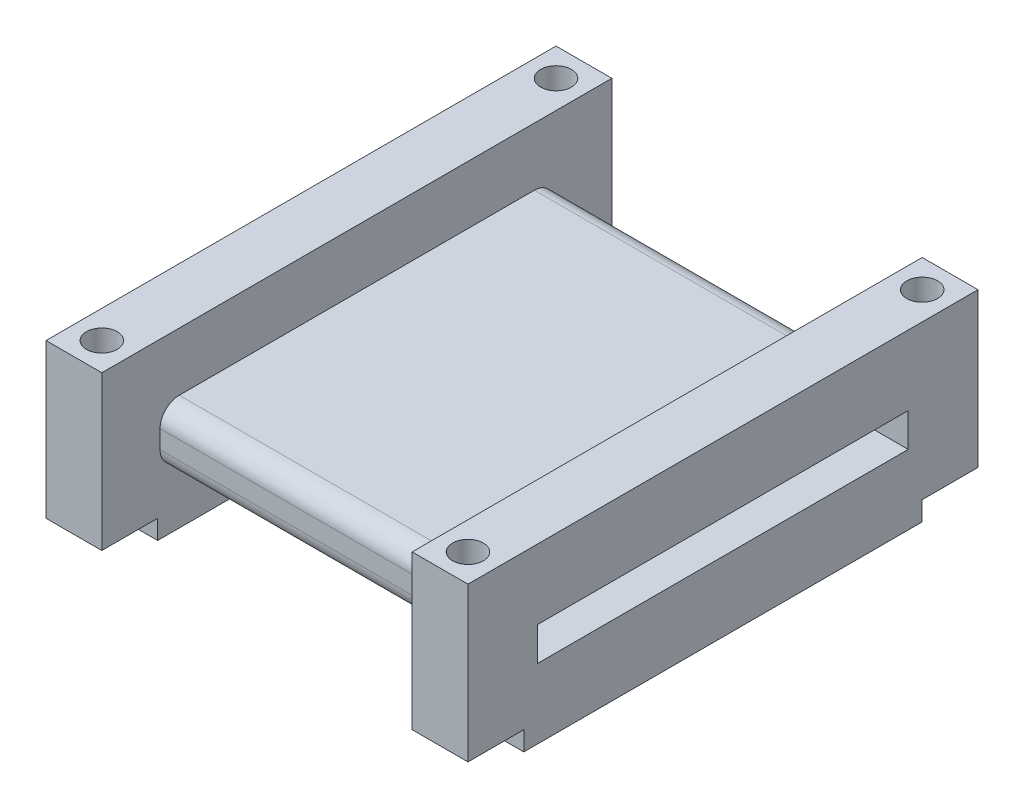
ISO-10303-21;
HEADER;
FILE_DESCRIPTION(('STEP AP214'),'2;1');
FILE_NAME('part.step','',(''),(''),'','','');
FILE_SCHEMA(('AUTOMOTIVE_DESIGN { 1 0 10303 214 1 1 1 1 }'));
ENDSEC;
DATA;
#1=APPLICATION_CONTEXT('core data for automotive mechanical design processes');
#2=APPLICATION_PROTOCOL_DEFINITION('international standard','automotive_design',2000,#1);
#3=PRODUCT_CONTEXT('',#1,'mechanical');
#4=PRODUCT('Part','Part','',(#3));
#5=PRODUCT_RELATED_PRODUCT_CATEGORY('part','',(#4));
#6=PRODUCT_DEFINITION_FORMATION('','',#4);
#7=PRODUCT_DEFINITION_CONTEXT('part definition',#1,'design');
#8=PRODUCT_DEFINITION('design','',#6,#7);
#9=PRODUCT_DEFINITION_SHAPE('','',#8);
#10=(LENGTH_UNIT() NAMED_UNIT(*) SI_UNIT(.MILLI.,.METRE.));
#11=(NAMED_UNIT(*) PLANE_ANGLE_UNIT() SI_UNIT($,.RADIAN.));
#12=(NAMED_UNIT(*) SI_UNIT($,.STERADIAN.) SOLID_ANGLE_UNIT());
#13=UNCERTAINTY_MEASURE_WITH_UNIT(LENGTH_MEASURE(1.E-05),#10,'distance_accuracy_value','');
#14=(GEOMETRIC_REPRESENTATION_CONTEXT(3) GLOBAL_UNCERTAINTY_ASSIGNED_CONTEXT((#13)) GLOBAL_UNIT_ASSIGNED_CONTEXT((#10,
#11,#12)) REPRESENTATION_CONTEXT('',''));
#15=CARTESIAN_POINT('',(0.,0.,0.));
#16=DIRECTION('',(0.,0.,1.));
#17=DIRECTION('',(1.,0.,0.));
#18=AXIS2_PLACEMENT_3D('',#15,#16,#17);
#19=CARTESIAN_POINT('',(32.25,0.,0.));
#20=DIRECTION('',(0.,0.,-1.));
#21=DIRECTION('',(-1.,0.,0.));
#22=AXIS2_PLACEMENT_3D('',#19,#20,#21);
#23=PLANE('',#22);
#24=DIRECTION('',(0.,-1.,0.));
#25=VECTOR('',#24,1.);
#26=CARTESIAN_POINT('',(0.,0.,0.));
#27=LINE('',#26,#25);
#28=CARTESIAN_POINT('',(0.,3.9,0.));
#29=VERTEX_POINT('',#28);
#30=CARTESIAN_POINT('',(0.,2.,0.));
#31=VERTEX_POINT('',#30);
#32=EDGE_CURVE('E361',#29,#31,#27,.T.);
#33=ORIENTED_EDGE('',*,*,#32,.T.);
#34=DIRECTION('',(-1.,0.,0.));
#35=VECTOR('',#34,1.);
#36=CARTESIAN_POINT('',(32.25,2.,0.));
#37=LINE('',#36,#35);
#38=CARTESIAN_POINT('',(32.25,2.,0.));
#39=VERTEX_POINT('',#38);
#40=EDGE_CURVE('E440',#31,#39,#37,.F.);
#41=ORIENTED_EDGE('',*,*,#40,.T.);
#42=DIRECTION('',(0.,-1.,0.));
#43=VECTOR('',#42,1.);
#44=CARTESIAN_POINT('',(32.25,0.,0.));
#45=LINE('',#44,#43);
#46=CARTESIAN_POINT('',(32.25,3.9,0.));
#47=VERTEX_POINT('',#46);
#48=EDGE_CURVE('E362',#47,#39,#45,.T.);
#49=ORIENTED_EDGE('',*,*,#48,.F.);
#50=DIRECTION('',(-1.,0.,0.));
#51=VECTOR('',#50,1.);
#52=CARTESIAN_POINT('',(32.25,3.9,0.));
#53=LINE('',#52,#51);
#54=EDGE_CURVE('E436',#47,#29,#53,.T.);
#55=ORIENTED_EDGE('',*,*,#54,.T.);
#56=EDGE_LOOP('',(#33,#41,#49,#55));
#57=FACE_BOUND('',#56,.T.);
#58=ADVANCED_FACE('F45',(#57),#23,.F.);
#59=CARTESIAN_POINT('',(32.25,0.,0.));
#60=DIRECTION('',(0.,1.,0.));
#61=DIRECTION('',(0.,0.,1.));
#62=AXIS2_PLACEMENT_3D('',#59,#60,#61);
#63=PLANE('',#62);
#64=DIRECTION('',(0.,0.,-1.));
#65=VECTOR('',#64,1.);
#66=CARTESIAN_POINT('',(0.,0.,0.));
#67=LINE('',#66,#65);
#68=CARTESIAN_POINT('',(0.,0.,-2.));
#69=VERTEX_POINT('',#68);
#70=CARTESIAN_POINT('',(0.,0.,-38.9));
#71=VERTEX_POINT('',#70);
#72=EDGE_CURVE('E382',#69,#71,#67,.T.);
#73=ORIENTED_EDGE('',*,*,#72,.T.);
#74=DIRECTION('',(-1.,0.,0.));
#75=VECTOR('',#74,1.);
#76=CARTESIAN_POINT('',(32.25,0.,-38.9));
#77=LINE('',#76,#75);
#78=CARTESIAN_POINT('',(32.25,0.,-38.9));
#79=VERTEX_POINT('',#78);
#80=EDGE_CURVE('E417',#71,#79,#77,.F.);
#81=ORIENTED_EDGE('',*,*,#80,.T.);
#82=DIRECTION('',(0.,0.,-1.));
#83=VECTOR('',#82,1.);
#84=CARTESIAN_POINT('',(32.25,0.,0.));
#85=LINE('',#84,#83);
#86=CARTESIAN_POINT('',(32.25,0.,-2.));
#87=VERTEX_POINT('',#86);
#88=EDGE_CURVE('E366',#87,#79,#85,.T.);
#89=ORIENTED_EDGE('',*,*,#88,.F.);
#90=DIRECTION('',(-1.,0.,0.));
#91=VECTOR('',#90,1.);
#92=CARTESIAN_POINT('',(32.25,0.,-2.));
#93=LINE('',#92,#91);
#94=EDGE_CURVE('E413',#87,#69,#93,.T.);
#95=ORIENTED_EDGE('',*,*,#94,.T.);
#96=EDGE_LOOP('',(#73,#81,#89,#95));
#97=FACE_BOUND('',#96,.T.);
#98=ADVANCED_FACE('F580',(#97),#63,.F.);
#99=CARTESIAN_POINT('',(32.25,0.,-40.9));
#100=DIRECTION('',(0.,0.,1.));
#101=DIRECTION('',(1.,0.,0.));
#102=AXIS2_PLACEMENT_3D('',#99,#100,#101);
#103=PLANE('',#102);
#104=DIRECTION('',(0.,1.,0.));
#105=VECTOR('',#104,1.);
#106=CARTESIAN_POINT('',(32.25,0.,-40.9));
#107=LINE('',#106,#105);
#108=CARTESIAN_POINT('',(32.25,2.,-40.9));
#109=VERTEX_POINT('',#108);
#110=CARTESIAN_POINT('',(32.25,3.9,-40.9));
#111=VERTEX_POINT('',#110);
#112=EDGE_CURVE('E371',#109,#111,#107,.T.);
#113=ORIENTED_EDGE('',*,*,#112,.F.);
#114=DIRECTION('',(-1.,0.,0.));
#115=VECTOR('',#114,1.);
#116=CARTESIAN_POINT('',(32.25,2.,-40.9));
#117=LINE('',#116,#115);
#118=CARTESIAN_POINT('',(0.,2.,-40.9));
#119=VERTEX_POINT('',#118);
#120=EDGE_CURVE('E393',#109,#119,#117,.T.);
#121=ORIENTED_EDGE('',*,*,#120,.T.);
#122=DIRECTION('',(0.,1.,0.));
#123=VECTOR('',#122,1.);
#124=CARTESIAN_POINT('',(0.,0.,-40.9));
#125=LINE('',#124,#123);
#126=CARTESIAN_POINT('',(0.,3.9,-40.9));
#127=VERTEX_POINT('',#126);
#128=EDGE_CURVE('E385',#119,#127,#125,.T.);
#129=ORIENTED_EDGE('',*,*,#128,.T.);
#130=DIRECTION('',(-1.,0.,0.));
#131=VECTOR('',#130,1.);
#132=CARTESIAN_POINT('',(32.25,3.9,-40.9));
#133=LINE('',#132,#131);
#134=EDGE_CURVE('E379',#127,#111,#133,.F.);
#135=ORIENTED_EDGE('',*,*,#134,.T.);
#136=EDGE_LOOP('',(#113,#121,#129,#135));
#137=FACE_BOUND('',#136,.T.);
#138=ADVANCED_FACE('F586',(#137),#103,.F.);
#139=CARTESIAN_POINT('',(32.25,5.9,0.));
#140=DIRECTION('',(0.,-1.,0.));
#141=DIRECTION('',(0.,0.,-1.));
#142=AXIS2_PLACEMENT_3D('',#139,#140,#141);
#143=PLANE('',#142);
#144=DIRECTION('',(0.,0.,1.));
#145=VECTOR('',#144,1.);
#146=CARTESIAN_POINT('',(0.,5.9,0.));
#147=LINE('',#146,#145);
#148=CARTESIAN_POINT('',(0.,5.9,-38.9));
#149=VERTEX_POINT('',#148);
#150=CARTESIAN_POINT('',(0.,5.9,-2.));
#151=VERTEX_POINT('',#150);
#152=EDGE_CURVE('E367',#149,#151,#147,.T.);
#153=ORIENTED_EDGE('',*,*,#152,.T.);
#154=DIRECTION('',(-1.,0.,0.));
#155=VECTOR('',#154,1.);
#156=CARTESIAN_POINT('',(32.25,5.9,-2.));
#157=LINE('',#156,#155);
#158=CARTESIAN_POINT('',(32.25,5.9,-2.));
#159=VERTEX_POINT('',#158);
#160=EDGE_CURVE('E11',#151,#159,#157,.F.);
#161=ORIENTED_EDGE('',*,*,#160,.T.);
#162=DIRECTION('',(0.,0.,1.));
#163=VECTOR('',#162,1.);
#164=CARTESIAN_POINT('',(32.25,5.9,0.));
#165=LINE('',#164,#163);
#166=CARTESIAN_POINT('',(32.25,5.9,-38.9));
#167=VERTEX_POINT('',#166);
#168=EDGE_CURVE('E375',#167,#159,#165,.T.);
#169=ORIENTED_EDGE('',*,*,#168,.F.);
#170=DIRECTION('',(-1.,0.,0.));
#171=VECTOR('',#170,1.);
#172=CARTESIAN_POINT('',(32.25,5.9,-38.9));
#173=LINE('',#172,#171);
#174=EDGE_CURVE('E55',#167,#149,#173,.T.);
#175=ORIENTED_EDGE('',*,*,#174,.T.);
#176=EDGE_LOOP('',(#153,#161,#169,#175));
#177=FACE_BOUND('',#176,.T.);
#178=ADVANCED_FACE('F608',(#177),#143,.F.);
#179=CARTESIAN_POINT('',(32.25,1.2,-39.7));
#180=DIRECTION('',(0.,0.,1.));
#181=DIRECTION('',(1.,0.,0.));
#182=AXIS2_PLACEMENT_3D('',#179,#180,#181);
#183=PLANE('',#182);
#184=DIRECTION('',(-1.,0.,0.));
#185=VECTOR('',#184,1.);
#186=CARTESIAN_POINT('',(32.25,4.7,-39.7));
#187=LINE('',#186,#185);
#188=CARTESIAN_POINT('',(38.05,4.7,-39.7));
#189=VERTEX_POINT('',#188);
#190=CARTESIAN_POINT('',(-5.8,4.7,-39.7));
#191=VERTEX_POINT('',#190);
#192=EDGE_CURVE('E358',#189,#191,#187,.T.);
#193=ORIENTED_EDGE('',*,*,#192,.T.);
#194=DIRECTION('',(0.,-1.,0.));
#195=VECTOR('',#194,1.);
#196=CARTESIAN_POINT('',(-5.8,1.2,-39.7));
#197=LINE('',#196,#195);
#198=CARTESIAN_POINT('',(-5.8,1.2,-39.7));
#199=VERTEX_POINT('',#198);
#200=EDGE_CURVE('E537',#191,#199,#197,.T.);
#201=ORIENTED_EDGE('',*,*,#200,.T.);
#202=DIRECTION('',(-1.,0.,0.));
#203=VECTOR('',#202,1.);
#204=CARTESIAN_POINT('',(32.25,1.2,-39.7));
#205=LINE('',#204,#203);
#206=CARTESIAN_POINT('',(38.05,1.2,-39.7));
#207=VERTEX_POINT('',#206);
#208=EDGE_CURVE('E349',#207,#199,#205,.T.);
#209=ORIENTED_EDGE('',*,*,#208,.F.);
#210=DIRECTION('',(0.,1.,0.));
#211=VECTOR('',#210,1.);
#212=CARTESIAN_POINT('',(38.05,1.2,-39.7));
#213=LINE('',#212,#211);
#214=EDGE_CURVE('E305',#207,#189,#213,.T.);
#215=ORIENTED_EDGE('',*,*,#214,.T.);
#216=EDGE_LOOP('',(#193,#201,#209,#215));
#217=FACE_BOUND('',#216,.T.);
#218=ADVANCED_FACE('F557',(#217),#183,.T.);
#219=CARTESIAN_POINT('',(32.25,4.7,-1.2));
#220=DIRECTION('',(0.,-1.,0.));
#221=DIRECTION('',(0.,0.,-1.));
#222=AXIS2_PLACEMENT_3D('',#219,#220,#221);
#223=PLANE('',#222);
#224=DIRECTION('',(-1.,0.,0.));
#225=VECTOR('',#224,1.);
#226=CARTESIAN_POINT('',(32.25,4.7,-1.2));
#227=LINE('',#226,#225);
#228=CARTESIAN_POINT('',(38.05,4.7,-1.2));
#229=VERTEX_POINT('',#228);
#230=CARTESIAN_POINT('',(-5.8,4.7,-1.19999999999998));
#231=VERTEX_POINT('',#230);
#232=EDGE_CURVE('E355',#229,#231,#227,.T.);
#233=ORIENTED_EDGE('',*,*,#232,.T.);
#234=DIRECTION('',(0.,0.,-1.));
#235=VECTOR('',#234,1.);
#236=CARTESIAN_POINT('',(-5.8,4.7,-1.19999999999998));
#237=LINE('',#236,#235);
#238=EDGE_CURVE('E275',#231,#191,#237,.T.);
#239=ORIENTED_EDGE('',*,*,#238,.T.);
#240=ORIENTED_EDGE('',*,*,#192,.F.);
#241=DIRECTION('',(0.,0.,1.));
#242=VECTOR('',#241,1.);
#243=CARTESIAN_POINT('',(38.05,4.7,-39.7));
#244=LINE('',#243,#242);
#245=EDGE_CURVE('E309',#189,#229,#244,.T.);
#246=ORIENTED_EDGE('',*,*,#245,.T.);
#247=EDGE_LOOP('',(#233,#239,#240,#246));
#248=FACE_BOUND('',#247,.T.);
#249=ADVANCED_FACE('F554',(#248),#223,.T.);
#250=CARTESIAN_POINT('',(32.25,1.2,-1.2));
#251=DIRECTION('',(0.,0.,-1.));
#252=DIRECTION('',(-1.,0.,0.));
#253=AXIS2_PLACEMENT_3D('',#250,#251,#252);
#254=PLANE('',#253);
#255=DIRECTION('',(-1.,0.,0.));
#256=VECTOR('',#255,1.);
#257=CARTESIAN_POINT('',(32.25,1.2,-1.2));
#258=LINE('',#257,#256);
#259=CARTESIAN_POINT('',(38.05,1.2,-1.2));
#260=VERTEX_POINT('',#259);
#261=CARTESIAN_POINT('',(-5.8,1.2,-1.19999999999998));
#262=VERTEX_POINT('',#261);
#263=EDGE_CURVE('E352',#260,#262,#258,.T.);
#264=ORIENTED_EDGE('',*,*,#263,.T.);
#265=DIRECTION('',(0.,1.,0.));
#266=VECTOR('',#265,1.);
#267=CARTESIAN_POINT('',(-5.8,1.2,-1.19999999999998));
#268=LINE('',#267,#266);
#269=EDGE_CURVE('E544',#262,#231,#268,.T.);
#270=ORIENTED_EDGE('',*,*,#269,.T.);
#271=ORIENTED_EDGE('',*,*,#232,.F.);
#272=DIRECTION('',(0.,-1.,0.));
#273=VECTOR('',#272,1.);
#274=CARTESIAN_POINT('',(38.05,1.2,-1.2));
#275=LINE('',#274,#273);
#276=EDGE_CURVE('E297',#229,#260,#275,.T.);
#277=ORIENTED_EDGE('',*,*,#276,.T.);
#278=EDGE_LOOP('',(#264,#270,#271,#277));
#279=FACE_BOUND('',#278,.T.);
#280=ADVANCED_FACE('F564',(#279),#254,.T.);
#281=CARTESIAN_POINT('',(32.25,1.2,-1.2));
#282=DIRECTION('',(0.,1.,0.));
#283=DIRECTION('',(0.,0.,1.));
#284=AXIS2_PLACEMENT_3D('',#281,#282,#283);
#285=PLANE('',#284);
#286=ORIENTED_EDGE('',*,*,#208,.T.);
#287=DIRECTION('',(0.,0.,1.));
#288=VECTOR('',#287,1.);
#289=CARTESIAN_POINT('',(-5.8,1.2,-1.19999999999998));
#290=LINE('',#289,#288);
#291=EDGE_CURVE('E541',#199,#262,#290,.T.);
#292=ORIENTED_EDGE('',*,*,#291,.T.);
#293=ORIENTED_EDGE('',*,*,#263,.F.);
#294=DIRECTION('',(0.,0.,-1.));
#295=VECTOR('',#294,1.);
#296=CARTESIAN_POINT('',(38.05,1.2,-39.7));
#297=LINE('',#296,#295);
#298=EDGE_CURVE('E301',#260,#207,#297,.T.);
#299=ORIENTED_EDGE('',*,*,#298,.T.);
#300=EDGE_LOOP('',(#286,#292,#293,#299));
#301=FACE_BOUND('',#300,.T.);
#302=ADVANCED_FACE('F566',(#301),#285,.T.);
#303=CARTESIAN_POINT('',(32.25,2.,-38.9));
#304=DIRECTION('',(-1.,0.,0.));
#305=DIRECTION('',(0.,0.,1.));
#306=AXIS2_PLACEMENT_3D('',#303,#304,#305);
#307=CYLINDRICAL_SURFACE('',#306,2.);
#308=CARTESIAN_POINT('',(32.25,2.,-38.9));
#309=DIRECTION('',(-1.,0.,0.));
#310=DIRECTION('',(0.,0.,1.));
#311=AXIS2_PLACEMENT_3D('',#308,#309,#310);
#312=CIRCLE('',#311,2.);
#313=EDGE_CURVE('E432',#79,#109,#312,.F.);
#314=ORIENTED_EDGE('',*,*,#313,.F.);
#315=ORIENTED_EDGE('',*,*,#80,.F.);
#316=CARTESIAN_POINT('',(0.,2.,-38.9));
#317=DIRECTION('',(-1.,0.,0.));
#318=DIRECTION('',(0.,0.,1.));
#319=AXIS2_PLACEMENT_3D('',#316,#317,#318);
#320=CIRCLE('',#319,2.);
#321=EDGE_CURVE('E409',#119,#71,#320,.T.);
#322=ORIENTED_EDGE('',*,*,#321,.F.);
#323=ORIENTED_EDGE('',*,*,#120,.F.);
#324=EDGE_LOOP('',(#314,#315,#322,#323));
#325=FACE_BOUND('',#324,.T.);
#326=ADVANCED_FACE('F568',(#325),#307,.T.);
#327=CARTESIAN_POINT('',(32.25,2.,-2.));
#328=DIRECTION('',(-1.,0.,0.));
#329=DIRECTION('',(0.,0.,1.));
#330=AXIS2_PLACEMENT_3D('',#327,#328,#329);
#331=CYLINDRICAL_SURFACE('',#330,2.);
#332=CARTESIAN_POINT('',(32.25,2.,-2.));
#333=DIRECTION('',(-1.,0.,0.));
#334=DIRECTION('',(0.,0.,1.));
#335=AXIS2_PLACEMENT_3D('',#332,#333,#334);
#336=CIRCLE('',#335,2.);
#337=EDGE_CURVE('E428',#39,#87,#336,.F.);
#338=ORIENTED_EDGE('',*,*,#337,.F.);
#339=ORIENTED_EDGE('',*,*,#40,.F.);
#340=CARTESIAN_POINT('',(0.,2.,-2.));
#341=DIRECTION('',(-1.,0.,0.));
#342=DIRECTION('',(0.,0.,1.));
#343=AXIS2_PLACEMENT_3D('',#340,#341,#342);
#344=CIRCLE('',#343,2.);
#345=EDGE_CURVE('E405',#69,#31,#344,.T.);
#346=ORIENTED_EDGE('',*,*,#345,.F.);
#347=ORIENTED_EDGE('',*,*,#94,.F.);
#348=EDGE_LOOP('',(#338,#339,#346,#347));
#349=FACE_BOUND('',#348,.T.);
#350=ADVANCED_FACE('F574',(#349),#331,.T.);
#351=CARTESIAN_POINT('',(32.25,3.9,-2.));
#352=DIRECTION('',(-1.,0.,0.));
#353=DIRECTION('',(0.,0.,1.));
#354=AXIS2_PLACEMENT_3D('',#351,#352,#353);
#355=CYLINDRICAL_SURFACE('',#354,2.);
#356=CARTESIAN_POINT('',(32.25,3.9,-2.));
#357=DIRECTION('',(-1.,0.,0.));
#358=DIRECTION('',(0.,0.,1.));
#359=AXIS2_PLACEMENT_3D('',#356,#357,#358);
#360=CIRCLE('',#359,2.);
#361=EDGE_CURVE('E424',#159,#47,#360,.F.);
#362=ORIENTED_EDGE('',*,*,#361,.F.);
#363=ORIENTED_EDGE('',*,*,#160,.F.);
#364=CARTESIAN_POINT('',(0.,3.9,-2.));
#365=DIRECTION('',(-1.,0.,0.));
#366=DIRECTION('',(0.,0.,1.));
#367=AXIS2_PLACEMENT_3D('',#364,#365,#366);
#368=CIRCLE('',#367,2.);
#369=EDGE_CURVE('E401',#29,#151,#368,.T.);
#370=ORIENTED_EDGE('',*,*,#369,.F.);
#371=ORIENTED_EDGE('',*,*,#54,.F.);
#372=EDGE_LOOP('',(#362,#363,#370,#371));
#373=FACE_BOUND('',#372,.T.);
#374=ADVANCED_FACE('F592',(#373),#355,.T.);
#375=CARTESIAN_POINT('',(32.25,3.9,-38.9));
#376=DIRECTION('',(-1.,0.,0.));
#377=DIRECTION('',(0.,0.,1.));
#378=AXIS2_PLACEMENT_3D('',#375,#376,#377);
#379=CYLINDRICAL_SURFACE('',#378,2.);
#380=CARTESIAN_POINT('',(32.25,3.9,-38.9));
#381=DIRECTION('',(-1.,0.,0.));
#382=DIRECTION('',(0.,0.,1.));
#383=AXIS2_PLACEMENT_3D('',#380,#381,#382);
#384=CIRCLE('',#383,2.);
#385=EDGE_CURVE('E420',#111,#167,#384,.F.);
#386=ORIENTED_EDGE('',*,*,#385,.F.);
#387=ORIENTED_EDGE('',*,*,#134,.F.);
#388=CARTESIAN_POINT('',(0.,3.9,-38.9));
#389=DIRECTION('',(-1.,0.,0.));
#390=DIRECTION('',(0.,0.,1.));
#391=AXIS2_PLACEMENT_3D('',#388,#389,#390);
#392=CIRCLE('',#391,2.);
#393=EDGE_CURVE('E397',#149,#127,#392,.T.);
#394=ORIENTED_EDGE('',*,*,#393,.F.);
#395=ORIENTED_EDGE('',*,*,#174,.F.);
#396=EDGE_LOOP('',(#386,#387,#394,#395));
#397=FACE_BOUND('',#396,.T.);
#398=ADVANCED_FACE('F47',(#397),#379,.T.);
#399=CARTESIAN_POINT('',(38.05,0.,0.));
#400=DIRECTION('',(-1.,0.,0.));
#401=DIRECTION('',(0.,0.,1.));
#402=AXIS2_PLACEMENT_3D('',#399,#400,#401);
#403=PLANE('',#402);
#404=DIRECTION('',(0.,1.,0.));
#405=VECTOR('',#404,1.);
#406=CARTESIAN_POINT('',(38.05,-6.05,-41.15));
#407=LINE('',#406,#405);
#408=CARTESIAN_POINT('',(38.05,-6.05,-41.15));
#409=VERTEX_POINT('',#408);
#410=CARTESIAN_POINT('',(38.05,-4.05,-41.15));
#411=VERTEX_POINT('',#410);
#412=EDGE_CURVE('E63',#409,#411,#407,.T.);
#413=ORIENTED_EDGE('',*,*,#412,.T.);
#414=DIRECTION('',(0.,0.,-1.));
#415=VECTOR('',#414,1.);
#416=CARTESIAN_POINT('',(38.05,-4.05,-46.95));
#417=LINE('',#416,#415);
#418=CARTESIAN_POINT('',(38.05,-4.05,-46.95));
#419=VERTEX_POINT('',#418);
#420=EDGE_CURVE('E459',#411,#419,#417,.T.);
#421=ORIENTED_EDGE('',*,*,#420,.T.);
#422=DIRECTION('',(0.,1.,0.));
#423=VECTOR('',#422,1.);
#424=CARTESIAN_POINT('',(38.05,-6.05,-46.95));
#425=LINE('',#424,#423);
#426=CARTESIAN_POINT('',(38.05,11.95,-46.95));
#427=VERTEX_POINT('',#426);
#428=EDGE_CURVE('E314',#419,#427,#425,.T.);
#429=ORIENTED_EDGE('',*,*,#428,.T.);
#430=DIRECTION('',(0.,0.,1.));
#431=VECTOR('',#430,1.);
#432=CARTESIAN_POINT('',(38.05,11.95,6.04999999999999));
#433=LINE('',#432,#431);
#434=CARTESIAN_POINT('',(38.05,11.95,6.04999999999999));
#435=VERTEX_POINT('',#434);
#436=EDGE_CURVE('E317',#427,#435,#433,.T.);
#437=ORIENTED_EDGE('',*,*,#436,.T.);
#438=DIRECTION('',(0.,-1.,0.));
#439=VECTOR('',#438,1.);
#440=CARTESIAN_POINT('',(38.05,-6.05,6.04999999999999));
#441=LINE('',#440,#439);
#442=CARTESIAN_POINT('',(38.05,-4.05,6.05000000000001));
#443=VERTEX_POINT('',#442);
#444=EDGE_CURVE('E321',#435,#443,#441,.T.);
#445=ORIENTED_EDGE('',*,*,#444,.T.);
#446=DIRECTION('',(0.,0.,-1.));
#447=VECTOR('',#446,1.);
#448=CARTESIAN_POINT('',(38.05,-4.05,6.05000000000001));
#449=LINE('',#448,#447);
#450=CARTESIAN_POINT('',(38.05,-4.05,0.250000000000015));
#451=VERTEX_POINT('',#450);
#452=EDGE_CURVE('E482',#443,#451,#449,.T.);
#453=ORIENTED_EDGE('',*,*,#452,.T.);
#454=DIRECTION('',(0.,-1.,0.));
#455=VECTOR('',#454,1.);
#456=CARTESIAN_POINT('',(38.05,-6.05,0.250000000000015));
#457=LINE('',#456,#455);
#458=CARTESIAN_POINT('',(38.05,-6.05,0.250000000000015));
#459=VERTEX_POINT('',#458);
#460=EDGE_CURVE('E469',#451,#459,#457,.T.);
#461=ORIENTED_EDGE('',*,*,#460,.T.);
#462=DIRECTION('',(0.,0.,-1.));
#463=VECTOR('',#462,1.);
#464=CARTESIAN_POINT('',(38.05,-6.05,6.04999999999999));
#465=LINE('',#464,#463);
#466=EDGE_CURVE('E325',#459,#409,#465,.T.);
#467=ORIENTED_EDGE('',*,*,#466,.T.);
#468=EDGE_LOOP('',(#413,#421,#429,#437,#445,#453,#461,#467));
#469=FACE_BOUND('',#468,.T.);
#470=ORIENTED_EDGE('',*,*,#276,.F.);
#471=ORIENTED_EDGE('',*,*,#245,.F.);
#472=ORIENTED_EDGE('',*,*,#214,.F.);
#473=ORIENTED_EDGE('',*,*,#298,.F.);
#474=EDGE_LOOP('',(#470,#471,#472,#473));
#475=FACE_BOUND('',#474,.T.);
#476=ADVANCED_FACE('F563',(#469,#475),#403,.F.);
#477=CARTESIAN_POINT('',(32.25,0.,0.));
#478=DIRECTION('',(-1.,0.,0.));
#479=DIRECTION('',(0.,0.,1.));
#480=AXIS2_PLACEMENT_3D('',#477,#478,#479);
#481=PLANE('',#480);
#482=DIRECTION('',(0.,0.,-1.));
#483=VECTOR('',#482,1.);
#484=CARTESIAN_POINT('',(32.25,-4.05,0.));
#485=LINE('',#484,#483);
#486=CARTESIAN_POINT('',(32.25,-4.05,-41.15));
#487=VERTEX_POINT('',#486);
#488=CARTESIAN_POINT('',(32.25,-4.05,-46.95));
#489=VERTEX_POINT('',#488);
#490=EDGE_CURVE('E494',#487,#489,#485,.T.);
#491=ORIENTED_EDGE('',*,*,#490,.F.);
#492=DIRECTION('',(0.,1.,0.));
#493=VECTOR('',#492,1.);
#494=CARTESIAN_POINT('',(32.25,0.,-41.15));
#495=LINE('',#494,#493);
#496=CARTESIAN_POINT('',(32.25,-6.05,-41.15));
#497=VERTEX_POINT('',#496);
#498=EDGE_CURVE('E518',#497,#487,#495,.T.);
#499=ORIENTED_EDGE('',*,*,#498,.F.);
#500=DIRECTION('',(0.,0.,-1.));
#501=VECTOR('',#500,1.);
#502=CARTESIAN_POINT('',(32.25,-6.05,6.04999999999999));
#503=LINE('',#502,#501);
#504=CARTESIAN_POINT('',(32.25,-6.05,0.250000000000015));
#505=VERTEX_POINT('',#504);
#506=EDGE_CURVE('E318',#505,#497,#503,.T.);
#507=ORIENTED_EDGE('',*,*,#506,.F.);
#508=DIRECTION('',(0.,-1.,0.));
#509=VECTOR('',#508,1.);
#510=CARTESIAN_POINT('',(32.25,0.,0.250000000000015));
#511=LINE('',#510,#509);
#512=CARTESIAN_POINT('',(32.25,-4.05,0.250000000000015));
#513=VERTEX_POINT('',#512);
#514=EDGE_CURVE('E71',#513,#505,#511,.T.);
#515=ORIENTED_EDGE('',*,*,#514,.F.);
#516=DIRECTION('',(0.,0.,-1.));
#517=VECTOR('',#516,1.);
#518=CARTESIAN_POINT('',(32.25,-4.05,0.));
#519=LINE('',#518,#517);
#520=CARTESIAN_POINT('',(32.25,-4.05,6.05000000000001));
#521=VERTEX_POINT('',#520);
#522=EDGE_CURVE('E505',#521,#513,#519,.T.);
#523=ORIENTED_EDGE('',*,*,#522,.F.);
#524=DIRECTION('',(0.,-1.,0.));
#525=VECTOR('',#524,1.);
#526=CARTESIAN_POINT('',(32.25,-6.05,6.04999999999999));
#527=LINE('',#526,#525);
#528=CARTESIAN_POINT('',(32.25,11.95,6.04999999999999));
#529=VERTEX_POINT('',#528);
#530=EDGE_CURVE('E335',#529,#521,#527,.T.);
#531=ORIENTED_EDGE('',*,*,#530,.F.);
#532=DIRECTION('',(0.,0.,1.));
#533=VECTOR('',#532,1.);
#534=CARTESIAN_POINT('',(32.25,11.95,6.04999999999999));
#535=LINE('',#534,#533);
#536=CARTESIAN_POINT('',(32.25,11.95,-46.95));
#537=VERTEX_POINT('',#536);
#538=EDGE_CURVE('E332',#537,#529,#535,.T.);
#539=ORIENTED_EDGE('',*,*,#538,.F.);
#540=DIRECTION('',(0.,1.,0.));
#541=VECTOR('',#540,1.);
#542=CARTESIAN_POINT('',(32.25,-6.05,-46.95));
#543=LINE('',#542,#541);
#544=EDGE_CURVE('E313',#489,#537,#543,.T.);
#545=ORIENTED_EDGE('',*,*,#544,.F.);
#546=EDGE_LOOP('',(#491,#499,#507,#515,#523,#531,#539,#545));
#547=FACE_BOUND('',#546,.T.);
#548=ORIENTED_EDGE('',*,*,#337,.T.);
#549=ORIENTED_EDGE('',*,*,#88,.T.);
#550=ORIENTED_EDGE('',*,*,#313,.T.);
#551=ORIENTED_EDGE('',*,*,#112,.T.);
#552=ORIENTED_EDGE('',*,*,#385,.T.);
#553=ORIENTED_EDGE('',*,*,#168,.T.);
#554=ORIENTED_EDGE('',*,*,#361,.T.);
#555=ORIENTED_EDGE('',*,*,#48,.T.);
#556=EDGE_LOOP('',(#548,#549,#550,#551,#552,#553,#554,#555));
#557=FACE_BOUND('',#556,.T.);
#558=ADVANCED_FACE('F604',(#547,#557),#481,.T.);
#559=CARTESIAN_POINT('',(38.05,-6.05,-46.95));
#560=DIRECTION('',(0.,0.,1.));
#561=DIRECTION('',(1.,0.,0.));
#562=AXIS2_PLACEMENT_3D('',#559,#560,#561);
#563=PLANE('',#562);
#564=ORIENTED_EDGE('',*,*,#428,.F.);
#565=DIRECTION('',(-1.,0.,0.));
#566=VECTOR('',#565,1.);
#567=CARTESIAN_POINT('',(38.05,-4.05,-46.95));
#568=LINE('',#567,#566);
#569=EDGE_CURVE('E255',#419,#489,#568,.T.);
#570=ORIENTED_EDGE('',*,*,#569,.T.);
#571=ORIENTED_EDGE('',*,*,#544,.T.);
#572=DIRECTION('',(-1.,0.,0.));
#573=VECTOR('',#572,1.);
#574=CARTESIAN_POINT('',(38.05,11.95,-46.95));
#575=LINE('',#574,#573);
#576=EDGE_CURVE('E345',#427,#537,#575,.T.);
#577=ORIENTED_EDGE('',*,*,#576,.F.);
#578=EDGE_LOOP('',(#564,#570,#571,#577));
#579=FACE_BOUND('',#578,.T.);
#580=ADVANCED_FACE('F686',(#579),#563,.F.);
#581=CARTESIAN_POINT('',(38.05,11.95,6.04999999999999));
#582=DIRECTION('',(0.,-1.,0.));
#583=DIRECTION('',(0.,0.,-1.));
#584=AXIS2_PLACEMENT_3D('',#581,#582,#583);
#585=PLANE('',#584);
#586=CARTESIAN_POINT('',(35.15,11.95,-44.05));
#587=DIRECTION('',(0.,1.,0.));
#588=DIRECTION('',(0.,0.,1.));
#589=AXIS2_PLACEMENT_3D('',#586,#587,#588);
#590=CIRCLE('',#589,1.6);
#591=CARTESIAN_POINT('',(35.15,11.95,-42.45));
#592=VERTEX_POINT('',#591);
#593=EDGE_CURVE('E526',#592,#592,#590,.T.);
#594=ORIENTED_EDGE('',*,*,#593,.F.);
#595=EDGE_LOOP('',(#594));
#596=FACE_BOUND('',#595,.T.);
#597=CARTESIAN_POINT('',(35.15,11.95,3.14999999999999));
#598=DIRECTION('',(0.,1.,0.));
#599=DIRECTION('',(0.,0.,1.));
#600=AXIS2_PLACEMENT_3D('',#597,#598,#599);
#601=CIRCLE('',#600,1.6);
#602=CARTESIAN_POINT('',(35.15,11.95,4.74999999999999));
#603=VERTEX_POINT('',#602);
#604=EDGE_CURVE('E521',#603,#603,#601,.T.);
#605=ORIENTED_EDGE('',*,*,#604,.F.);
#606=EDGE_LOOP('',(#605));
#607=FACE_BOUND('',#606,.T.);
#608=ORIENTED_EDGE('',*,*,#538,.T.);
#609=DIRECTION('',(-1.,0.,0.));
#610=VECTOR('',#609,1.);
#611=CARTESIAN_POINT('',(38.05,11.95,6.04999999999999));
#612=LINE('',#611,#610);
#613=EDGE_CURVE('E329',#435,#529,#612,.T.);
#614=ORIENTED_EDGE('',*,*,#613,.F.);
#615=ORIENTED_EDGE('',*,*,#436,.F.);
#616=ORIENTED_EDGE('',*,*,#576,.T.);
#617=EDGE_LOOP('',(#608,#614,#615,#616));
#618=FACE_BOUND('',#617,.T.);
#619=ADVANCED_FACE('F680',(#596,#607,#618),#585,.F.);
#620=CARTESIAN_POINT('',(38.05,-6.05,6.04999999999999));
#621=DIRECTION('',(0.,0.,-1.));
#622=DIRECTION('',(-1.,0.,0.));
#623=AXIS2_PLACEMENT_3D('',#620,#621,#622);
#624=PLANE('',#623);
#625=ORIENTED_EDGE('',*,*,#530,.T.);
#626=DIRECTION('',(-1.,0.,0.));
#627=VECTOR('',#626,1.);
#628=CARTESIAN_POINT('',(38.05,-4.05,6.05000000000001));
#629=LINE('',#628,#627);
#630=EDGE_CURVE('E466',#443,#521,#629,.T.);
#631=ORIENTED_EDGE('',*,*,#630,.F.);
#632=ORIENTED_EDGE('',*,*,#444,.F.);
#633=ORIENTED_EDGE('',*,*,#613,.T.);
#634=EDGE_LOOP('',(#625,#631,#632,#633));
#635=FACE_BOUND('',#634,.T.);
#636=ADVANCED_FACE('F685',(#635),#624,.F.);
#637=CARTESIAN_POINT('',(38.05,-6.05,6.04999999999999));
#638=DIRECTION('',(0.,1.,0.));
#639=DIRECTION('',(0.,0.,1.));
#640=AXIS2_PLACEMENT_3D('',#637,#638,#639);
#641=PLANE('',#640);
#642=ORIENTED_EDGE('',*,*,#506,.T.);
#643=DIRECTION('',(-1.,0.,0.));
#644=VECTOR('',#643,1.);
#645=CARTESIAN_POINT('',(38.05,-6.05,-41.15));
#646=LINE('',#645,#644);
#647=EDGE_CURVE('E463',#409,#497,#646,.T.);
#648=ORIENTED_EDGE('',*,*,#647,.F.);
#649=ORIENTED_EDGE('',*,*,#466,.F.);
#650=DIRECTION('',(-1.,0.,0.));
#651=VECTOR('',#650,1.);
#652=CARTESIAN_POINT('',(38.05,-6.05,0.250000000000015));
#653=LINE('',#652,#651);
#654=EDGE_CURVE('E475',#459,#505,#653,.T.);
#655=ORIENTED_EDGE('',*,*,#654,.T.);
#656=EDGE_LOOP('',(#642,#648,#649,#655));
#657=FACE_BOUND('',#656,.T.);
#658=ADVANCED_FACE('F742',(#657),#641,.F.);
#659=CARTESIAN_POINT('',(0.,0.,0.));
#660=DIRECTION('',(-1.,0.,0.));
#661=DIRECTION('',(0.,0.,1.));
#662=AXIS2_PLACEMENT_3D('',#659,#660,#661);
#663=PLANE('',#662);
#664=DIRECTION('',(0.,1.,0.));
#665=VECTOR('',#664,1.);
#666=CARTESIAN_POINT('',(0.,0.,-41.15));
#667=LINE('',#666,#665);
#668=CARTESIAN_POINT('',(0.,-6.05,-41.15));
#669=VERTEX_POINT('',#668);
#670=CARTESIAN_POINT('',(0.,-4.05,-41.15));
#671=VERTEX_POINT('',#670);
#672=EDGE_CURVE('E514',#669,#671,#667,.T.);
#673=ORIENTED_EDGE('',*,*,#672,.T.);
#674=DIRECTION('',(0.,0.,-1.));
#675=VECTOR('',#674,1.);
#676=CARTESIAN_POINT('',(0.,-4.05,0.));
#677=LINE('',#676,#675);
#678=CARTESIAN_POINT('',(0.,-4.05,-46.95));
#679=VERTEX_POINT('',#678);
#680=EDGE_CURVE('E454',#671,#679,#677,.T.);
#681=ORIENTED_EDGE('',*,*,#680,.T.);
#682=DIRECTION('',(0.,-1.,0.));
#683=VECTOR('',#682,1.);
#684=CARTESIAN_POINT('',(0.,-6.05,-46.95));
#685=LINE('',#684,#683);
#686=CARTESIAN_POINT('',(0.,11.95,-46.95));
#687=VERTEX_POINT('',#686);
#688=EDGE_CURVE('E253',#687,#679,#685,.T.);
#689=ORIENTED_EDGE('',*,*,#688,.F.);
#690=DIRECTION('',(0.,0.,-1.));
#691=VECTOR('',#690,1.);
#692=CARTESIAN_POINT('',(0.,11.95,6.05000000000001));
#693=LINE('',#692,#691);
#694=CARTESIAN_POINT('',(0.,11.95,6.05000000000001));
#695=VERTEX_POINT('',#694);
#696=EDGE_CURVE('E265',#695,#687,#693,.T.);
#697=ORIENTED_EDGE('',*,*,#696,.F.);
#698=DIRECTION('',(0.,1.,0.));
#699=VECTOR('',#698,1.);
#700=CARTESIAN_POINT('',(0.,-6.05,6.05000000000001));
#701=LINE('',#700,#699);
#702=CARTESIAN_POINT('',(0.,-4.05,6.05000000000001));
#703=VERTEX_POINT('',#702);
#704=EDGE_CURVE('E272',#703,#695,#701,.T.);
#705=ORIENTED_EDGE('',*,*,#704,.F.);
#706=DIRECTION('',(0.,0.,-1.));
#707=VECTOR('',#706,1.);
#708=CARTESIAN_POINT('',(0.,-4.05,0.));
#709=LINE('',#708,#707);
#710=CARTESIAN_POINT('',(0.,-4.05,0.250000000000015));
#711=VERTEX_POINT('',#710);
#712=EDGE_CURVE('E501',#703,#711,#709,.T.);
#713=ORIENTED_EDGE('',*,*,#712,.T.);
#714=DIRECTION('',(0.,-1.,0.));
#715=VECTOR('',#714,1.);
#716=CARTESIAN_POINT('',(0.,0.,0.250000000000015));
#717=LINE('',#716,#715);
#718=CARTESIAN_POINT('',(0.,-6.05,0.250000000000015));
#719=VERTEX_POINT('',#718);
#720=EDGE_CURVE('E508',#711,#719,#717,.T.);
#721=ORIENTED_EDGE('',*,*,#720,.T.);
#722=DIRECTION('',(0.,0.,1.));
#723=VECTOR('',#722,1.);
#724=CARTESIAN_POINT('',(0.,-6.05,6.05000000000001));
#725=LINE('',#724,#723);
#726=EDGE_CURVE('E285',#669,#719,#725,.T.);
#727=ORIENTED_EDGE('',*,*,#726,.F.);
#728=EDGE_LOOP('',(#673,#681,#689,#697,#705,#713,#721,#727));
#729=FACE_BOUND('',#728,.T.);
#730=ORIENTED_EDGE('',*,*,#128,.F.);
#731=ORIENTED_EDGE('',*,*,#321,.T.);
#732=ORIENTED_EDGE('',*,*,#72,.F.);
#733=ORIENTED_EDGE('',*,*,#345,.T.);
#734=ORIENTED_EDGE('',*,*,#32,.F.);
#735=ORIENTED_EDGE('',*,*,#369,.T.);
#736=ORIENTED_EDGE('',*,*,#152,.F.);
#737=ORIENTED_EDGE('',*,*,#393,.T.);
#738=EDGE_LOOP('',(#730,#731,#732,#733,#734,#735,#736,#737));
#739=FACE_BOUND('',#738,.T.);
#740=ADVANCED_FACE('F612',(#729,#739),#663,.F.);
#741=CARTESIAN_POINT('',(-5.8,0.,0.));
#742=DIRECTION('',(-1.,0.,0.));
#743=DIRECTION('',(0.,0.,1.));
#744=AXIS2_PLACEMENT_3D('',#741,#742,#743);
#745=PLANE('',#744);
#746=DIRECTION('',(0.,0.,-1.));
#747=VECTOR('',#746,1.);
#748=CARTESIAN_POINT('',(-5.8,-4.05,-46.95));
#749=LINE('',#748,#747);
#750=CARTESIAN_POINT('',(-5.8,-4.05,-41.15));
#751=VERTEX_POINT('',#750);
#752=CARTESIAN_POINT('',(-5.8,-4.05,-46.95));
#753=VERTEX_POINT('',#752);
#754=EDGE_CURVE('E232',#751,#753,#749,.T.);
#755=ORIENTED_EDGE('',*,*,#754,.F.);
#756=DIRECTION('',(0.,1.,0.));
#757=VECTOR('',#756,1.);
#758=CARTESIAN_POINT('',(-5.8,-6.05,-41.15));
#759=LINE('',#758,#757);
#760=CARTESIAN_POINT('',(-5.8,-6.05,-41.15));
#761=VERTEX_POINT('',#760);
#762=EDGE_CURVE('E244',#761,#751,#759,.T.);
#763=ORIENTED_EDGE('',*,*,#762,.F.);
#764=DIRECTION('',(0.,0.,1.));
#765=VECTOR('',#764,1.);
#766=CARTESIAN_POINT('',(-5.8,-6.05,6.05000000000001));
#767=LINE('',#766,#765);
#768=CARTESIAN_POINT('',(-5.8,-6.05,0.250000000000015));
#769=VERTEX_POINT('',#768);
#770=EDGE_CURVE('E264',#761,#769,#767,.T.);
#771=ORIENTED_EDGE('',*,*,#770,.T.);
#772=DIRECTION('',(0.,-1.,0.));
#773=VECTOR('',#772,1.);
#774=CARTESIAN_POINT('',(-5.8,-6.05,0.250000000000015));
#775=LINE('',#774,#773);
#776=CARTESIAN_POINT('',(-5.8,-4.05,0.250000000000015));
#777=VERTEX_POINT('',#776);
#778=EDGE_CURVE('E479',#777,#769,#775,.T.);
#779=ORIENTED_EDGE('',*,*,#778,.F.);
#780=DIRECTION('',(0.,0.,-1.));
#781=VECTOR('',#780,1.);
#782=CARTESIAN_POINT('',(-5.8,-4.05,6.05000000000001));
#783=LINE('',#782,#781);
#784=CARTESIAN_POINT('',(-5.8,-4.05,6.05000000000001));
#785=VERTEX_POINT('',#784);
#786=EDGE_CURVE('E256',#785,#777,#783,.T.);
#787=ORIENTED_EDGE('',*,*,#786,.F.);
#788=DIRECTION('',(0.,1.,0.));
#789=VECTOR('',#788,1.);
#790=CARTESIAN_POINT('',(-5.8,-6.05,6.05000000000001));
#791=LINE('',#790,#789);
#792=CARTESIAN_POINT('',(-5.8,11.95,6.05000000000001));
#793=VERTEX_POINT('',#792);
#794=EDGE_CURVE('E270',#785,#793,#791,.T.);
#795=ORIENTED_EDGE('',*,*,#794,.T.);
#796=DIRECTION('',(0.,0.,-1.));
#797=VECTOR('',#796,1.);
#798=CARTESIAN_POINT('',(-5.8,11.95,6.05000000000001));
#799=LINE('',#798,#797);
#800=CARTESIAN_POINT('',(-5.8,11.95,-46.95));
#801=VERTEX_POINT('',#800);
#802=EDGE_CURVE('E261',#793,#801,#799,.T.);
#803=ORIENTED_EDGE('',*,*,#802,.T.);
#804=DIRECTION('',(0.,-1.,0.));
#805=VECTOR('',#804,1.);
#806=CARTESIAN_POINT('',(-5.8,-6.05,-46.95));
#807=LINE('',#806,#805);
#808=EDGE_CURVE('E251',#801,#753,#807,.T.);
#809=ORIENTED_EDGE('',*,*,#808,.T.);
#810=EDGE_LOOP('',(#755,#763,#771,#779,#787,#795,#803,#809));
#811=FACE_BOUND('',#810,.T.);
#812=ORIENTED_EDGE('',*,*,#291,.F.);
#813=ORIENTED_EDGE('',*,*,#200,.F.);
#814=ORIENTED_EDGE('',*,*,#238,.F.);
#815=ORIENTED_EDGE('',*,*,#269,.F.);
#816=EDGE_LOOP('',(#812,#813,#814,#815));
#817=FACE_BOUND('',#816,.T.);
#818=ADVANCED_FACE('F258',(#811,#817),#745,.T.);
#819=CARTESIAN_POINT('',(-5.8,-6.05,-46.95));
#820=DIRECTION('',(0.,0.,1.));
#821=DIRECTION('',(1.,0.,0.));
#822=AXIS2_PLACEMENT_3D('',#819,#820,#821);
#823=PLANE('',#822);
#824=ORIENTED_EDGE('',*,*,#688,.T.);
#825=EDGE_CURVE('E235',#679,#753,#568,.T.);
#826=ORIENTED_EDGE('',*,*,#825,.T.);
#827=ORIENTED_EDGE('',*,*,#808,.F.);
#828=DIRECTION('',(1.,0.,0.));
#829=VECTOR('',#828,1.);
#830=CARTESIAN_POINT('',(-5.8,11.95,-46.95));
#831=LINE('',#830,#829);
#832=EDGE_CURVE('E282',#801,#687,#831,.T.);
#833=ORIENTED_EDGE('',*,*,#832,.T.);
#834=EDGE_LOOP('',(#824,#826,#827,#833));
#835=FACE_BOUND('',#834,.T.);
#836=ADVANCED_FACE('F249',(#835),#823,.F.);
#837=CARTESIAN_POINT('',(-5.8,-6.05,6.05000000000001));
#838=DIRECTION('',(0.,1.,0.));
#839=DIRECTION('',(0.,0.,1.));
#840=AXIS2_PLACEMENT_3D('',#837,#838,#839);
#841=PLANE('',#840);
#842=ORIENTED_EDGE('',*,*,#770,.F.);
#843=EDGE_CURVE('E1030',#669,#761,#646,.T.);
#844=ORIENTED_EDGE('',*,*,#843,.F.);
#845=ORIENTED_EDGE('',*,*,#726,.T.);
#846=EDGE_CURVE('E478',#719,#769,#653,.T.);
#847=ORIENTED_EDGE('',*,*,#846,.T.);
#848=EDGE_LOOP('',(#842,#844,#845,#847));
#849=FACE_BOUND('',#848,.T.);
#850=ADVANCED_FACE('F782',(#849),#841,.F.);
#851=CARTESIAN_POINT('',(-5.8,-6.05,6.05000000000001));
#852=DIRECTION('',(0.,0.,-1.));
#853=DIRECTION('',(-1.,0.,0.));
#854=AXIS2_PLACEMENT_3D('',#851,#852,#853);
#855=PLANE('',#854);
#856=ORIENTED_EDGE('',*,*,#794,.F.);
#857=EDGE_CURVE('E470',#703,#785,#629,.T.);
#858=ORIENTED_EDGE('',*,*,#857,.F.);
#859=ORIENTED_EDGE('',*,*,#704,.T.);
#860=DIRECTION('',(1.,0.,0.));
#861=VECTOR('',#860,1.);
#862=CARTESIAN_POINT('',(-5.8,11.95,6.05000000000001));
#863=LINE('',#862,#861);
#864=EDGE_CURVE('E293',#793,#695,#863,.T.);
#865=ORIENTED_EDGE('',*,*,#864,.F.);
#866=EDGE_LOOP('',(#856,#858,#859,#865));
#867=FACE_BOUND('',#866,.T.);
#868=ADVANCED_FACE('F703',(#867),#855,.F.);
#869=CARTESIAN_POINT('',(-5.8,11.95,6.05000000000001));
#870=DIRECTION('',(0.,-1.,0.));
#871=DIRECTION('',(0.,0.,-1.));
#872=AXIS2_PLACEMENT_3D('',#869,#870,#871);
#873=PLANE('',#872);
#874=CARTESIAN_POINT('',(-2.89999999999999,11.95,3.15000000000001));
#875=DIRECTION('',(0.,1.,0.));
#876=DIRECTION('',(0.,0.,1.));
#877=AXIS2_PLACEMENT_3D('',#874,#875,#876);
#878=CIRCLE('',#877,1.6);
#879=CARTESIAN_POINT('',(-2.89999999999999,11.95,4.75000000000001));
#880=VERTEX_POINT('',#879);
#881=EDGE_CURVE('E525',#880,#880,#878,.T.);
#882=ORIENTED_EDGE('',*,*,#881,.F.);
#883=EDGE_LOOP('',(#882));
#884=FACE_BOUND('',#883,.T.);
#885=CARTESIAN_POINT('',(-2.9,11.95,-44.05));
#886=DIRECTION('',(0.,1.,0.));
#887=DIRECTION('',(0.,0.,1.));
#888=AXIS2_PLACEMENT_3D('',#885,#886,#887);
#889=CIRCLE('',#888,1.59999999999999);
#890=CARTESIAN_POINT('',(-2.9,11.95,-42.45));
#891=VERTEX_POINT('',#890);
#892=EDGE_CURVE('E530',#891,#891,#889,.T.);
#893=ORIENTED_EDGE('',*,*,#892,.F.);
#894=EDGE_LOOP('',(#893));
#895=FACE_BOUND('',#894,.T.);
#896=ORIENTED_EDGE('',*,*,#696,.T.);
#897=ORIENTED_EDGE('',*,*,#832,.F.);
#898=ORIENTED_EDGE('',*,*,#802,.F.);
#899=ORIENTED_EDGE('',*,*,#864,.T.);
#900=EDGE_LOOP('',(#896,#897,#898,#899));
#901=FACE_BOUND('',#900,.T.);
#902=ADVANCED_FACE('F697',(#884,#895,#901),#873,.F.);
#903=CARTESIAN_POINT('',(-2.9,-6.05,-44.05));
#904=DIRECTION('',(0.,1.,0.));
#905=DIRECTION('',(0.,0.,1.));
#906=AXIS2_PLACEMENT_3D('',#903,#904,#905);
#907=CYLINDRICAL_SURFACE('',#906,1.59999999999999);
#908=CARTESIAN_POINT('',(-2.9,-4.05,-44.05));
#909=DIRECTION('',(0.,1.,0.));
#910=DIRECTION('',(0.,0.,1.));
#911=AXIS2_PLACEMENT_3D('',#908,#909,#910);
#912=CIRCLE('',#911,1.59999999999999);
#913=CARTESIAN_POINT('',(-2.9,-4.05,-42.45));
#914=VERTEX_POINT('',#913);
#915=EDGE_CURVE('E448',#914,#914,#912,.F.);
#916=ORIENTED_EDGE('',*,*,#915,.T.);
#917=EDGE_LOOP('',(#916));
#918=FACE_BOUND('',#917,.T.);
#919=ORIENTED_EDGE('',*,*,#892,.T.);
#920=EDGE_LOOP('',(#919));
#921=FACE_BOUND('',#920,.T.);
#922=ADVANCED_FACE('F702',(#918,#921),#907,.F.);
#923=CARTESIAN_POINT('',(-2.89999999999999,-6.05,3.15000000000001));
#924=DIRECTION('',(0.,1.,0.));
#925=DIRECTION('',(0.,0.,1.));
#926=AXIS2_PLACEMENT_3D('',#923,#924,#925);
#927=CYLINDRICAL_SURFACE('',#926,1.6);
#928=CARTESIAN_POINT('',(-2.89999999999999,-4.05,3.15000000000001));
#929=DIRECTION('',(0.,1.,0.));
#930=DIRECTION('',(0.,0.,1.));
#931=AXIS2_PLACEMENT_3D('',#928,#929,#930);
#932=CIRCLE('',#931,1.6);
#933=CARTESIAN_POINT('',(-2.89999999999999,-4.05,4.75000000000001));
#934=VERTEX_POINT('',#933);
#935=EDGE_CURVE('E497',#934,#934,#932,.F.);
#936=ORIENTED_EDGE('',*,*,#935,.T.);
#937=EDGE_LOOP('',(#936));
#938=FACE_BOUND('',#937,.T.);
#939=ORIENTED_EDGE('',*,*,#881,.T.);
#940=EDGE_LOOP('',(#939));
#941=FACE_BOUND('',#940,.T.);
#942=ADVANCED_FACE('F808',(#938,#941),#927,.F.);
#943=CARTESIAN_POINT('',(35.15,-6.05,3.14999999999999));
#944=DIRECTION('',(0.,1.,0.));
#945=DIRECTION('',(0.,0.,1.));
#946=AXIS2_PLACEMENT_3D('',#943,#944,#945);
#947=CYLINDRICAL_SURFACE('',#946,1.6);
#948=CARTESIAN_POINT('',(35.15,-4.05,3.14999999999999));
#949=DIRECTION('',(0.,1.,0.));
#950=DIRECTION('',(0.,0.,1.));
#951=AXIS2_PLACEMENT_3D('',#948,#949,#950);
#952=CIRCLE('',#951,1.6);
#953=CARTESIAN_POINT('',(35.15,-4.05,4.74999999999999));
#954=VERTEX_POINT('',#953);
#955=EDGE_CURVE('E49',#954,#954,#952,.F.);
#956=ORIENTED_EDGE('',*,*,#955,.T.);
#957=EDGE_LOOP('',(#956));
#958=FACE_BOUND('',#957,.T.);
#959=ORIENTED_EDGE('',*,*,#604,.T.);
#960=EDGE_LOOP('',(#959));
#961=FACE_BOUND('',#960,.T.);
#962=ADVANCED_FACE('F819',(#958,#961),#947,.F.);
#963=CARTESIAN_POINT('',(35.15,-6.05,-44.05));
#964=DIRECTION('',(0.,1.,0.));
#965=DIRECTION('',(0.,0.,1.));
#966=AXIS2_PLACEMENT_3D('',#963,#964,#965);
#967=CYLINDRICAL_SURFACE('',#966,1.6);
#968=CARTESIAN_POINT('',(35.15,-4.05,-44.05));
#969=DIRECTION('',(0.,1.,0.));
#970=DIRECTION('',(0.,0.,1.));
#971=AXIS2_PLACEMENT_3D('',#968,#969,#970);
#972=CIRCLE('',#971,1.6);
#973=CARTESIAN_POINT('',(35.15,-4.05,-42.45));
#974=VERTEX_POINT('',#973);
#975=EDGE_CURVE('E445',#974,#974,#972,.F.);
#976=ORIENTED_EDGE('',*,*,#975,.T.);
#977=EDGE_LOOP('',(#976));
#978=FACE_BOUND('',#977,.T.);
#979=ORIENTED_EDGE('',*,*,#593,.T.);
#980=EDGE_LOOP('',(#979));
#981=FACE_BOUND('',#980,.T.);
#982=ADVANCED_FACE('F830',(#978,#981),#967,.F.);
#983=CARTESIAN_POINT('',(38.05,-4.05,-46.95));
#984=DIRECTION('',(0.,1.,0.));
#985=DIRECTION('',(0.,0.,1.));
#986=AXIS2_PLACEMENT_3D('',#983,#984,#985);
#987=PLANE('',#986);
#988=ORIENTED_EDGE('',*,*,#490,.T.);
#989=ORIENTED_EDGE('',*,*,#569,.F.);
#990=ORIENTED_EDGE('',*,*,#420,.F.);
#991=DIRECTION('',(-1.,0.,0.));
#992=VECTOR('',#991,1.);
#993=CARTESIAN_POINT('',(38.05,-4.05,-41.15));
#994=LINE('',#993,#992);
#995=EDGE_CURVE('E1025',#411,#487,#994,.T.);
#996=ORIENTED_EDGE('',*,*,#995,.T.);
#997=EDGE_LOOP('',(#988,#989,#990,#996));
#998=FACE_BOUND('',#997,.T.);
#999=ORIENTED_EDGE('',*,*,#975,.F.);
#1000=EDGE_LOOP('',(#999));
#1001=FACE_BOUND('',#1000,.T.);
#1002=ADVANCED_FACE('F841',(#998,#1001),#987,.F.);
#1003=CARTESIAN_POINT('',(38.05,-6.05,-41.15));
#1004=DIRECTION('',(0.,0.,1.));
#1005=DIRECTION('',(1.,0.,0.));
#1006=AXIS2_PLACEMENT_3D('',#1003,#1004,#1005);
#1007=PLANE('',#1006);
#1008=ORIENTED_EDGE('',*,*,#498,.T.);
#1009=ORIENTED_EDGE('',*,*,#995,.F.);
#1010=ORIENTED_EDGE('',*,*,#412,.F.);
#1011=ORIENTED_EDGE('',*,*,#647,.T.);
#1012=EDGE_LOOP('',(#1008,#1009,#1010,#1011));
#1013=FACE_BOUND('',#1012,.T.);
#1014=ADVANCED_FACE('F851',(#1013),#1007,.F.);
#1015=CARTESIAN_POINT('',(38.05,-4.05,6.05000000000001));
#1016=DIRECTION('',(0.,1.,0.));
#1017=DIRECTION('',(0.,0.,1.));
#1018=AXIS2_PLACEMENT_3D('',#1015,#1016,#1017);
#1019=PLANE('',#1018);
#1020=ORIENTED_EDGE('',*,*,#522,.T.);
#1021=DIRECTION('',(-1.,0.,0.));
#1022=VECTOR('',#1021,1.);
#1023=CARTESIAN_POINT('',(38.05,-4.05,0.250000000000015));
#1024=LINE('',#1023,#1022);
#1025=EDGE_CURVE('E471',#451,#513,#1024,.T.);
#1026=ORIENTED_EDGE('',*,*,#1025,.F.);
#1027=ORIENTED_EDGE('',*,*,#452,.F.);
#1028=ORIENTED_EDGE('',*,*,#630,.T.);
#1029=EDGE_LOOP('',(#1020,#1026,#1027,#1028));
#1030=FACE_BOUND('',#1029,.T.);
#1031=ORIENTED_EDGE('',*,*,#955,.F.);
#1032=EDGE_LOOP('',(#1031));
#1033=FACE_BOUND('',#1032,.T.);
#1034=ADVANCED_FACE('F862',(#1030,#1033),#1019,.F.);
#1035=CARTESIAN_POINT('',(38.05,-6.05,0.250000000000015));
#1036=DIRECTION('',(0.,0.,-1.));
#1037=DIRECTION('',(-1.,0.,0.));
#1038=AXIS2_PLACEMENT_3D('',#1035,#1036,#1037);
#1039=PLANE('',#1038);
#1040=ORIENTED_EDGE('',*,*,#514,.T.);
#1041=ORIENTED_EDGE('',*,*,#654,.F.);
#1042=ORIENTED_EDGE('',*,*,#460,.F.);
#1043=ORIENTED_EDGE('',*,*,#1025,.T.);
#1044=EDGE_LOOP('',(#1040,#1041,#1042,#1043));
#1045=FACE_BOUND('',#1044,.T.);
#1046=ADVANCED_FACE('F873',(#1045),#1039,.F.);
#1047=EDGE_CURVE('E474',#711,#777,#1024,.T.);
#1048=ORIENTED_EDGE('',*,*,#1047,.T.);
#1049=ORIENTED_EDGE('',*,*,#778,.T.);
#1050=ORIENTED_EDGE('',*,*,#846,.F.);
#1051=ORIENTED_EDGE('',*,*,#720,.F.);
#1052=EDGE_LOOP('',(#1048,#1049,#1050,#1051));
#1053=FACE_BOUND('',#1052,.T.);
#1054=ADVANCED_FACE('F885',(#1053),#1039,.F.);
#1055=ORIENTED_EDGE('',*,*,#935,.F.);
#1056=EDGE_LOOP('',(#1055));
#1057=FACE_BOUND('',#1056,.T.);
#1058=ORIENTED_EDGE('',*,*,#857,.T.);
#1059=ORIENTED_EDGE('',*,*,#786,.T.);
#1060=ORIENTED_EDGE('',*,*,#1047,.F.);
#1061=ORIENTED_EDGE('',*,*,#712,.F.);
#1062=EDGE_LOOP('',(#1058,#1059,#1060,#1061));
#1063=FACE_BOUND('',#1062,.T.);
#1064=ADVANCED_FACE('F876',(#1057,#1063),#1019,.F.);
#1065=ORIENTED_EDGE('',*,*,#843,.T.);
#1066=ORIENTED_EDGE('',*,*,#762,.T.);
#1067=EDGE_CURVE('E238',#671,#751,#994,.T.);
#1068=ORIENTED_EDGE('',*,*,#1067,.F.);
#1069=ORIENTED_EDGE('',*,*,#672,.F.);
#1070=EDGE_LOOP('',(#1065,#1066,#1068,#1069));
#1071=FACE_BOUND('',#1070,.T.);
#1072=ADVANCED_FACE('F864',(#1071),#1007,.F.);
#1073=ORIENTED_EDGE('',*,*,#915,.F.);
#1074=EDGE_LOOP('',(#1073));
#1075=FACE_BOUND('',#1074,.T.);
#1076=ORIENTED_EDGE('',*,*,#1067,.T.);
#1077=ORIENTED_EDGE('',*,*,#754,.T.);
#1078=ORIENTED_EDGE('',*,*,#825,.F.);
#1079=ORIENTED_EDGE('',*,*,#680,.F.);
#1080=EDGE_LOOP('',(#1076,#1077,#1078,#1079));
#1081=FACE_BOUND('',#1080,.T.);
#1082=ADVANCED_FACE('F234',(#1075,#1081),#987,.F.);
#1083=CLOSED_SHELL('',(#58,#98,#138,#178,#218,#249,#280,#302,#326,#350,#374,#398,#476,#558,#580,
#619,#636,#658,#740,#818,#836,#850,#868,#902,#922,#942,#962,#982,#1002,#1014,#1034,#1046,#1054,
#1064,#1072,#1082));
#1084=MANIFOLD_SOLID_BREP('B2',#1083);
#1085=ADVANCED_BREP_SHAPE_REPRESENTATION('',(#18,#1084),#14);
#1086=SHAPE_DEFINITION_REPRESENTATION(#9,#1085);
ENDSEC;
END-ISO-10303-21;
